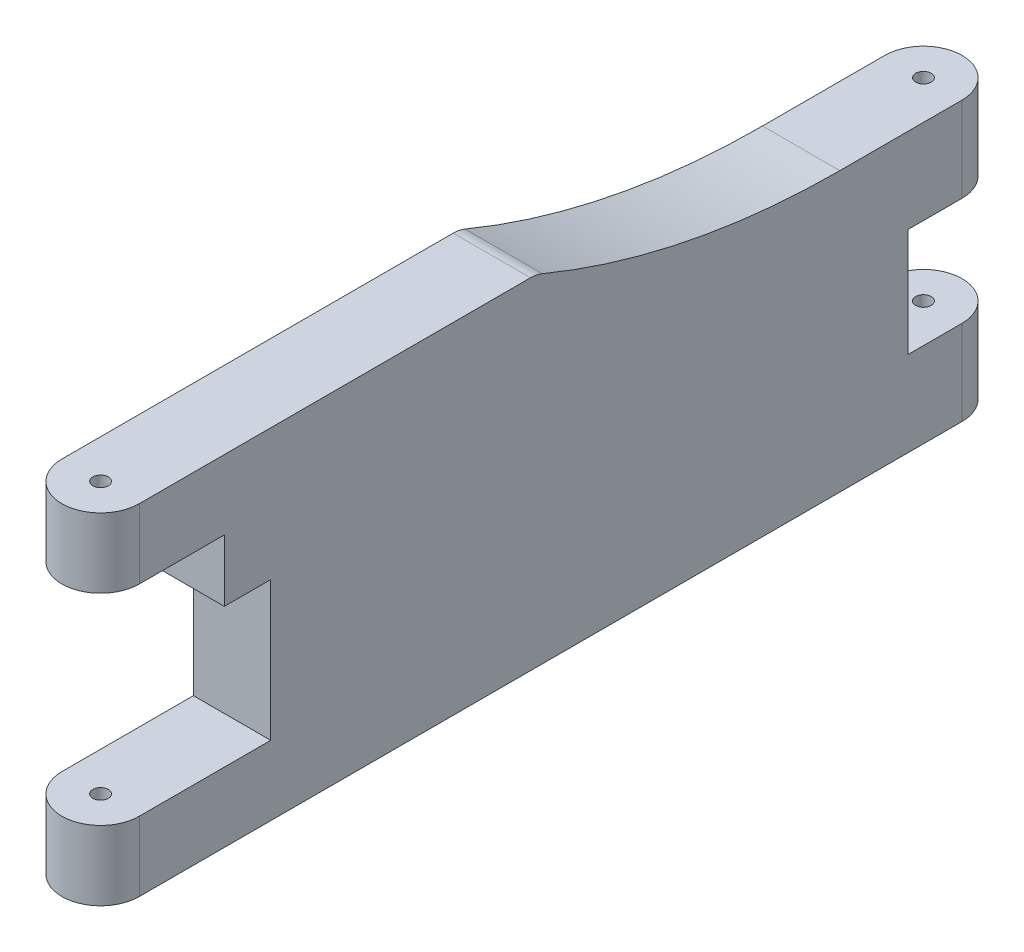
ISO-10303-21;
HEADER;
FILE_DESCRIPTION(('STEP AP214'),'2;1');
FILE_NAME('part.step','',(''),(''),'','','');
FILE_SCHEMA(('AUTOMOTIVE_DESIGN { 1 0 10303 214 1 1 1 1 }'));
ENDSEC;
DATA;
#1=APPLICATION_CONTEXT('core data for automotive mechanical design processes');
#2=APPLICATION_PROTOCOL_DEFINITION('international standard','automotive_design',2000,#1);
#3=PRODUCT_CONTEXT('',#1,'mechanical');
#4=PRODUCT('Part','Part','',(#3));
#5=PRODUCT_RELATED_PRODUCT_CATEGORY('part','',(#4));
#6=PRODUCT_DEFINITION_FORMATION('','',#4);
#7=PRODUCT_DEFINITION_CONTEXT('part definition',#1,'design');
#8=PRODUCT_DEFINITION('design','',#6,#7);
#9=PRODUCT_DEFINITION_SHAPE('','',#8);
#10=(LENGTH_UNIT() NAMED_UNIT(*) SI_UNIT(.MILLI.,.METRE.));
#11=(NAMED_UNIT(*) PLANE_ANGLE_UNIT() SI_UNIT($,.RADIAN.));
#12=(NAMED_UNIT(*) SI_UNIT($,.STERADIAN.) SOLID_ANGLE_UNIT());
#13=UNCERTAINTY_MEASURE_WITH_UNIT(LENGTH_MEASURE(1.E-05),#10,'distance_accuracy_value','');
#14=(GEOMETRIC_REPRESENTATION_CONTEXT(3) GLOBAL_UNCERTAINTY_ASSIGNED_CONTEXT((#13)) GLOBAL_UNIT_ASSIGNED_CONTEXT((#10,
#11,#12)) REPRESENTATION_CONTEXT('',''));
#15=CARTESIAN_POINT('',(0.,0.,0.));
#16=DIRECTION('',(0.,0.,1.));
#17=DIRECTION('',(1.,0.,0.));
#18=AXIS2_PLACEMENT_3D('',#15,#16,#17);
#19=CARTESIAN_POINT('',(0.,22.,0.));
#20=DIRECTION('',(0.,-1.,0.));
#21=DIRECTION('',(0.,0.,-1.));
#22=AXIS2_PLACEMENT_3D('',#19,#20,#21);
#23=CYLINDRICAL_SURFACE('',#22,2.5);
#24=CARTESIAN_POINT('',(0.,5.5,0.));
#25=DIRECTION('',(0.,-1.,0.));
#26=DIRECTION('',(0.,0.,-1.));
#27=AXIS2_PLACEMENT_3D('',#24,#25,#26);
#28=CIRCLE('',#27,2.5);
#29=CARTESIAN_POINT('',(-2.5,5.5,0.));
#30=VERTEX_POINT('',#29);
#31=CARTESIAN_POINT('',(2.5,5.5,0.));
#32=VERTEX_POINT('',#31);
#33=EDGE_CURVE('E212',#30,#32,#28,.T.);
#34=ORIENTED_EDGE('',*,*,#33,.T.);
#35=DIRECTION('',(0.,-1.,0.));
#36=VECTOR('',#35,1.);
#37=CARTESIAN_POINT('',(2.5,22.,0.));
#38=LINE('',#37,#36);
#39=CARTESIAN_POINT('',(2.5,0.,0.));
#40=VERTEX_POINT('',#39);
#41=EDGE_CURVE('E322',#32,#40,#38,.T.);
#42=ORIENTED_EDGE('',*,*,#41,.T.);
#43=CARTESIAN_POINT('',(0.,0.,0.));
#44=DIRECTION('',(0.,1.,0.));
#45=DIRECTION('',(0.,0.,1.));
#46=AXIS2_PLACEMENT_3D('',#43,#44,#45);
#47=CIRCLE('',#46,2.5);
#48=CARTESIAN_POINT('',(-2.5,0.,0.));
#49=VERTEX_POINT('',#48);
#50=EDGE_CURVE('E310',#40,#49,#47,.T.);
#51=ORIENTED_EDGE('',*,*,#50,.T.);
#52=DIRECTION('',(0.,-1.,0.));
#53=VECTOR('',#52,1.);
#54=CARTESIAN_POINT('',(-2.5,22.,0.));
#55=LINE('',#54,#53);
#56=EDGE_CURVE('E318',#30,#49,#55,.T.);
#57=ORIENTED_EDGE('',*,*,#56,.F.);
#58=EDGE_LOOP('',(#34,#42,#51,#57));
#59=FACE_BOUND('',#58,.T.);
#60=ADVANCED_FACE('F35',(#59),#23,.T.);
#61=CARTESIAN_POINT('',(0.,22.,0.));
#62=DIRECTION('',(0.,-1.,0.));
#63=DIRECTION('',(0.,0.,-1.));
#64=AXIS2_PLACEMENT_3D('',#61,#62,#63);
#65=CYLINDRICAL_SURFACE('',#64,0.5);
#66=CARTESIAN_POINT('',(0.,5.5,0.));
#67=DIRECTION('',(0.,-1.,0.));
#68=DIRECTION('',(0.,0.,-1.));
#69=AXIS2_PLACEMENT_3D('',#66,#67,#68);
#70=CIRCLE('',#69,0.5);
#71=CARTESIAN_POINT('',(0.,5.5,-0.5));
#72=VERTEX_POINT('',#71);
#73=EDGE_CURVE('E39',#72,#72,#70,.T.);
#74=ORIENTED_EDGE('',*,*,#73,.F.);
#75=EDGE_LOOP('',(#74));
#76=FACE_BOUND('',#75,.T.);
#77=CARTESIAN_POINT('',(0.,0.,0.));
#78=DIRECTION('',(0.,1.,0.));
#79=DIRECTION('',(0.,0.,1.));
#80=AXIS2_PLACEMENT_3D('',#77,#78,#79);
#81=CIRCLE('',#80,0.5);
#82=CARTESIAN_POINT('',(0.,0.,0.5));
#83=VERTEX_POINT('',#82);
#84=EDGE_CURVE('E290',#83,#83,#81,.T.);
#85=ORIENTED_EDGE('',*,*,#84,.F.);
#86=EDGE_LOOP('',(#85));
#87=FACE_BOUND('',#86,.T.);
#88=ADVANCED_FACE('F370',(#76,#87),#65,.F.);
#89=CARTESIAN_POINT('',(0.,22.,53.2));
#90=DIRECTION('',(0.,-1.,0.));
#91=DIRECTION('',(0.,0.,-1.));
#92=AXIS2_PLACEMENT_3D('',#89,#90,#91);
#93=CYLINDRICAL_SURFACE('',#92,2.5);
#94=CARTESIAN_POINT('',(0.,17.5,53.2));
#95=DIRECTION('',(0.,1.,0.));
#96=DIRECTION('',(0.,0.,1.));
#97=AXIS2_PLACEMENT_3D('',#94,#95,#96);
#98=CIRCLE('',#97,2.5);
#99=CARTESIAN_POINT('',(-2.5,17.5,53.2));
#100=VERTEX_POINT('',#99);
#101=CARTESIAN_POINT('',(2.5,17.5,53.2));
#102=VERTEX_POINT('',#101);
#103=EDGE_CURVE('E284',#100,#102,#98,.T.);
#104=ORIENTED_EDGE('',*,*,#103,.T.);
#105=DIRECTION('',(0.,-1.,0.));
#106=VECTOR('',#105,1.);
#107=CARTESIAN_POINT('',(2.5,22.,53.2));
#108=LINE('',#107,#106);
#109=CARTESIAN_POINT('',(2.5,22.,53.2));
#110=VERTEX_POINT('',#109);
#111=EDGE_CURVE('E326',#110,#102,#108,.T.);
#112=ORIENTED_EDGE('',*,*,#111,.F.);
#113=CARTESIAN_POINT('',(0.,22.,53.2));
#114=DIRECTION('',(0.,1.,0.));
#115=DIRECTION('',(0.,0.,-1.));
#116=AXIS2_PLACEMENT_3D('',#113,#114,#115);
#117=CIRCLE('',#116,2.5);
#118=CARTESIAN_POINT('',(-2.5,22.,53.2));
#119=VERTEX_POINT('',#118);
#120=EDGE_CURVE('E296',#119,#110,#117,.T.);
#121=ORIENTED_EDGE('',*,*,#120,.F.);
#122=DIRECTION('',(0.,-1.,0.));
#123=VECTOR('',#122,1.);
#124=CARTESIAN_POINT('',(-2.5,22.,53.2));
#125=LINE('',#124,#123);
#126=EDGE_CURVE('E315',#119,#100,#125,.T.);
#127=ORIENTED_EDGE('',*,*,#126,.T.);
#128=EDGE_LOOP('',(#104,#112,#121,#127));
#129=FACE_BOUND('',#128,.T.);
#130=ADVANCED_FACE('F428',(#129),#93,.T.);
#131=CARTESIAN_POINT('',(0.,22.,53.2));
#132=DIRECTION('',(0.,-1.,0.));
#133=DIRECTION('',(0.,0.,-1.));
#134=AXIS2_PLACEMENT_3D('',#131,#132,#133);
#135=CYLINDRICAL_SURFACE('',#134,0.500000000000001);
#136=CARTESIAN_POINT('',(0.,17.5,53.2));
#137=DIRECTION('',(0.,1.,0.));
#138=DIRECTION('',(0.,0.,1.));
#139=AXIS2_PLACEMENT_3D('',#136,#137,#138);
#140=CIRCLE('',#139,0.500000000000001);
#141=CARTESIAN_POINT('',(0.,17.5,53.7));
#142=VERTEX_POINT('',#141);
#143=EDGE_CURVE('E283',#142,#142,#140,.T.);
#144=ORIENTED_EDGE('',*,*,#143,.F.);
#145=EDGE_LOOP('',(#144));
#146=FACE_BOUND('',#145,.T.);
#147=CARTESIAN_POINT('',(0.,22.,53.2));
#148=DIRECTION('',(0.,1.,0.));
#149=DIRECTION('',(0.,0.,1.));
#150=AXIS2_PLACEMENT_3D('',#147,#148,#149);
#151=CIRCLE('',#150,0.500000000000001);
#152=CARTESIAN_POINT('',(0.,22.,53.7));
#153=VERTEX_POINT('',#152);
#154=EDGE_CURVE('E287',#153,#153,#151,.T.);
#155=ORIENTED_EDGE('',*,*,#154,.T.);
#156=EDGE_LOOP('',(#155));
#157=FACE_BOUND('',#156,.T.);
#158=ADVANCED_FACE('F465',(#146,#157),#135,.F.);
#159=CARTESIAN_POINT('',(0.,22.,53.2));
#160=DIRECTION('',(0.,-1.,0.));
#161=DIRECTION('',(0.,0.,-1.));
#162=AXIS2_PLACEMENT_3D('',#159,#160,#161);
#163=PLANE('',#162);
#164=DIRECTION('',(0.,0.,-1.));
#165=VECTOR('',#164,1.);
#166=CARTESIAN_POINT('',(2.5,22.,53.2));
#167=LINE('',#166,#165);
#168=CARTESIAN_POINT('',(2.5,22.,27.9040820577346));
#169=VERTEX_POINT('',#168);
#170=EDGE_CURVE('E299',#110,#169,#167,.T.);
#171=ORIENTED_EDGE('',*,*,#170,.T.);
#172=DIRECTION('',(1.,0.,0.));
#173=VECTOR('',#172,1.);
#174=CARTESIAN_POINT('',(0.,22.,27.9040820577346));
#175=LINE('',#174,#173);
#176=CARTESIAN_POINT('',(-2.5,22.,27.9040820577346));
#177=VERTEX_POINT('',#176);
#178=EDGE_CURVE('E44',#169,#177,#175,.F.);
#179=ORIENTED_EDGE('',*,*,#178,.T.);
#180=DIRECTION('',(0.,0.,1.));
#181=VECTOR('',#180,1.);
#182=CARTESIAN_POINT('',(-2.5,22.,24.7780810445954));
#183=LINE('',#182,#181);
#184=EDGE_CURVE('E302',#177,#119,#183,.T.);
#185=ORIENTED_EDGE('',*,*,#184,.T.);
#186=ORIENTED_EDGE('',*,*,#120,.T.);
#187=EDGE_LOOP('',(#171,#179,#185,#186));
#188=FACE_BOUND('',#187,.T.);
#189=ORIENTED_EDGE('',*,*,#154,.F.);
#190=EDGE_LOOP('',(#189));
#191=FACE_BOUND('',#190,.T.);
#192=ADVANCED_FACE('F461',(#188,#191),#163,.F.);
#193=CARTESIAN_POINT('',(0.,0.,53.2));
#194=DIRECTION('',(0.,-1.,0.));
#195=DIRECTION('',(0.,0.,-1.));
#196=AXIS2_PLACEMENT_3D('',#193,#194,#195);
#197=PLANE('',#196);
#198=ORIENTED_EDGE('',*,*,#84,.T.);
#199=EDGE_LOOP('',(#198));
#200=FACE_BOUND('',#199,.T.);
#201=CARTESIAN_POINT('',(0.,0.,53.2));
#202=DIRECTION('',(0.,1.,0.));
#203=DIRECTION('',(0.,0.,-1.));
#204=AXIS2_PLACEMENT_3D('',#201,#202,#203);
#205=CIRCLE('',#204,2.5);
#206=CARTESIAN_POINT('',(-2.5,0.,53.2));
#207=VERTEX_POINT('',#206);
#208=CARTESIAN_POINT('',(2.5,0.,53.2));
#209=VERTEX_POINT('',#208);
#210=EDGE_CURVE('E295',#207,#209,#205,.T.);
#211=ORIENTED_EDGE('',*,*,#210,.F.);
#212=DIRECTION('',(0.,0.,1.));
#213=VECTOR('',#212,1.);
#214=CARTESIAN_POINT('',(-2.5,0.,53.2));
#215=LINE('',#214,#213);
#216=EDGE_CURVE('E300',#49,#207,#215,.T.);
#217=ORIENTED_EDGE('',*,*,#216,.F.);
#218=ORIENTED_EDGE('',*,*,#50,.F.);
#219=DIRECTION('',(0.,0.,-1.));
#220=VECTOR('',#219,1.);
#221=CARTESIAN_POINT('',(2.5,0.,53.2));
#222=LINE('',#221,#220);
#223=EDGE_CURVE('E307',#209,#40,#222,.T.);
#224=ORIENTED_EDGE('',*,*,#223,.F.);
#225=EDGE_LOOP('',(#211,#217,#218,#224));
#226=FACE_BOUND('',#225,.T.);
#227=CARTESIAN_POINT('',(0.,0.,53.2));
#228=DIRECTION('',(0.,1.,0.));
#229=DIRECTION('',(0.,0.,1.));
#230=AXIS2_PLACEMENT_3D('',#227,#228,#229);
#231=CIRCLE('',#230,0.500000000000001);
#232=CARTESIAN_POINT('',(0.,0.,53.7));
#233=VERTEX_POINT('',#232);
#234=EDGE_CURVE('E286',#233,#233,#231,.T.);
#235=ORIENTED_EDGE('',*,*,#234,.T.);
#236=EDGE_LOOP('',(#235));
#237=FACE_BOUND('',#236,.T.);
#238=ADVANCED_FACE('F399',(#200,#226,#237),#197,.T.);
#239=CARTESIAN_POINT('',(2.5,4.5,53.2));
#240=VERTEX_POINT('',#239);
#241=EDGE_CURVE('E325',#240,#209,#108,.T.);
#242=ORIENTED_EDGE('',*,*,#241,.F.);
#243=CARTESIAN_POINT('',(0.,4.5,53.2));
#244=DIRECTION('',(0.,-1.,0.));
#245=DIRECTION('',(0.,0.,-1.));
#246=AXIS2_PLACEMENT_3D('',#243,#244,#245);
#247=CIRCLE('',#246,2.5);
#248=CARTESIAN_POINT('',(-2.5,4.5,53.2));
#249=VERTEX_POINT('',#248);
#250=EDGE_CURVE('E281',#240,#249,#247,.T.);
#251=ORIENTED_EDGE('',*,*,#250,.T.);
#252=EDGE_CURVE('E304',#249,#207,#125,.T.);
#253=ORIENTED_EDGE('',*,*,#252,.T.);
#254=ORIENTED_EDGE('',*,*,#210,.T.);
#255=EDGE_LOOP('',(#242,#251,#253,#254));
#256=FACE_BOUND('',#255,.T.);
#257=ADVANCED_FACE('F405',(#256),#93,.T.);
#258=CARTESIAN_POINT('',(2.5,22.,53.2));
#259=DIRECTION('',(-1.,0.,0.));
#260=DIRECTION('',(0.,0.,1.));
#261=AXIS2_PLACEMENT_3D('',#258,#259,#260);
#262=PLANE('',#261);
#263=ORIENTED_EDGE('',*,*,#41,.F.);
#264=DIRECTION('',(0.,0.,-1.));
#265=VECTOR('',#264,1.);
#266=CARTESIAN_POINT('',(2.5,5.5,-2.5));
#267=LINE('',#266,#265);
#268=CARTESIAN_POINT('',(2.5,5.5,3.5));
#269=VERTEX_POINT('',#268);
#270=EDGE_CURVE('E200',#269,#32,#267,.T.);
#271=ORIENTED_EDGE('',*,*,#270,.F.);
#272=DIRECTION('',(0.,-1.,0.));
#273=VECTOR('',#272,1.);
#274=CARTESIAN_POINT('',(2.5,5.5,3.5));
#275=LINE('',#274,#273);
#276=CARTESIAN_POINT('',(2.5,12.5,3.5));
#277=VERTEX_POINT('',#276);
#278=EDGE_CURVE('E189',#277,#269,#275,.T.);
#279=ORIENTED_EDGE('',*,*,#278,.F.);
#280=DIRECTION('',(0.,0.,1.));
#281=VECTOR('',#280,1.);
#282=CARTESIAN_POINT('',(2.5,12.5,3.5));
#283=LINE('',#282,#281);
#284=CARTESIAN_POINT('',(2.5,12.5,0.));
#285=VERTEX_POINT('',#284);
#286=EDGE_CURVE('E179',#285,#277,#283,.T.);
#287=ORIENTED_EDGE('',*,*,#286,.F.);
#288=CARTESIAN_POINT('',(2.5,18.,0.));
#289=VERTEX_POINT('',#288);
#290=EDGE_CURVE('E323',#289,#285,#38,.T.);
#291=ORIENTED_EDGE('',*,*,#290,.F.);
#292=DIRECTION('',(0.,0.,-1.));
#293=VECTOR('',#292,1.);
#294=CARTESIAN_POINT('',(2.5,18.,-2.5));
#295=LINE('',#294,#293);
#296=CARTESIAN_POINT('',(2.5,18.,7.90408205773456));
#297=VERTEX_POINT('',#296);
#298=EDGE_CURVE('E214',#297,#289,#295,.T.);
#299=ORIENTED_EDGE('',*,*,#298,.F.);
#300=CARTESIAN_POINT('',(2.5,68.,7.90408205773457));
#301=DIRECTION('',(-1.,0.,0.));
#302=DIRECTION('',(0.,0.,1.));
#303=AXIS2_PLACEMENT_3D('',#300,#301,#302);
#304=CIRCLE('',#303,50.);
#305=CARTESIAN_POINT('',(2.5,21.8461538461538,27.1348512885038));
#306=VERTEX_POINT('',#305);
#307=EDGE_CURVE('E350',#297,#306,#304,.T.);
#308=ORIENTED_EDGE('',*,*,#307,.T.);
#309=CARTESIAN_POINT('',(2.5,20.,27.9040820577346));
#310=DIRECTION('',(-1.,0.,0.));
#311=DIRECTION('',(0.,0.,1.));
#312=AXIS2_PLACEMENT_3D('',#309,#310,#311);
#313=CIRCLE('',#312,2.);
#314=EDGE_CURVE('E358',#306,#169,#313,.F.);
#315=ORIENTED_EDGE('',*,*,#314,.T.);
#316=ORIENTED_EDGE('',*,*,#170,.F.);
#317=ORIENTED_EDGE('',*,*,#111,.T.);
#318=DIRECTION('',(0.,0.,1.));
#319=VECTOR('',#318,1.);
#320=CARTESIAN_POINT('',(2.5,17.5,55.7));
#321=LINE('',#320,#319);
#322=CARTESIAN_POINT('',(2.5,17.5,47.7));
#323=VERTEX_POINT('',#322);
#324=EDGE_CURVE('E253',#323,#102,#321,.T.);
#325=ORIENTED_EDGE('',*,*,#324,.F.);
#326=DIRECTION('',(0.,1.,0.));
#327=VECTOR('',#326,1.);
#328=CARTESIAN_POINT('',(2.5,13.5,47.7));
#329=LINE('',#328,#327);
#330=CARTESIAN_POINT('',(2.5,13.5,47.7));
#331=VERTEX_POINT('',#330);
#332=EDGE_CURVE('E250',#331,#323,#329,.T.);
#333=ORIENTED_EDGE('',*,*,#332,.F.);
#334=DIRECTION('',(0.,0.,1.));
#335=VECTOR('',#334,1.);
#336=CARTESIAN_POINT('',(2.5,13.5,44.7));
#337=LINE('',#336,#335);
#338=CARTESIAN_POINT('',(2.5,13.5,44.7));
#339=VERTEX_POINT('',#338);
#340=EDGE_CURVE('E247',#339,#331,#337,.T.);
#341=ORIENTED_EDGE('',*,*,#340,.F.);
#342=DIRECTION('',(0.,1.,0.));
#343=VECTOR('',#342,1.);
#344=CARTESIAN_POINT('',(2.5,13.5,44.7));
#345=LINE('',#344,#343);
#346=CARTESIAN_POINT('',(2.5,4.5,44.7));
#347=VERTEX_POINT('',#346);
#348=EDGE_CURVE('E244',#347,#339,#345,.T.);
#349=ORIENTED_EDGE('',*,*,#348,.F.);
#350=DIRECTION('',(0.,0.,-1.));
#351=VECTOR('',#350,1.);
#352=CARTESIAN_POINT('',(2.5,4.5,44.7));
#353=LINE('',#352,#351);
#354=EDGE_CURVE('E237',#240,#347,#353,.T.);
#355=ORIENTED_EDGE('',*,*,#354,.F.);
#356=ORIENTED_EDGE('',*,*,#241,.T.);
#357=ORIENTED_EDGE('',*,*,#223,.T.);
#358=EDGE_LOOP('',(#263,#271,#279,#287,#291,#299,#308,#315,#316,#317,#325,#333,#341,#349,#355,
#356,#357));
#359=FACE_BOUND('',#358,.T.);
#360=ADVANCED_FACE('F198',(#359),#262,.F.);
#361=ORIENTED_EDGE('',*,*,#290,.T.);
#362=CARTESIAN_POINT('',(0.,12.5,0.));
#363=DIRECTION('',(0.,1.,0.));
#364=DIRECTION('',(0.,0.,1.));
#365=AXIS2_PLACEMENT_3D('',#362,#363,#364);
#366=CIRCLE('',#365,2.5);
#367=CARTESIAN_POINT('',(-2.5,12.5,0.));
#368=VERTEX_POINT('',#367);
#369=EDGE_CURVE('E184',#285,#368,#366,.T.);
#370=ORIENTED_EDGE('',*,*,#369,.T.);
#371=CARTESIAN_POINT('',(-2.5,18.,0.));
#372=VERTEX_POINT('',#371);
#373=EDGE_CURVE('E319',#372,#368,#55,.T.);
#374=ORIENTED_EDGE('',*,*,#373,.F.);
#375=CARTESIAN_POINT('',(0.,18.,0.));
#376=DIRECTION('',(0.,-1.,0.));
#377=DIRECTION('',(0.,0.,-1.));
#378=AXIS2_PLACEMENT_3D('',#375,#376,#377);
#379=CIRCLE('',#378,2.5);
#380=EDGE_CURVE('E219',#372,#289,#379,.T.);
#381=ORIENTED_EDGE('',*,*,#380,.T.);
#382=EDGE_LOOP('',(#361,#370,#374,#381));
#383=FACE_BOUND('',#382,.T.);
#384=ADVANCED_FACE('F389',(#383),#23,.T.);
#385=CARTESIAN_POINT('',(-2.5,22.,53.2));
#386=DIRECTION('',(1.,0.,0.));
#387=DIRECTION('',(0.,0.,-1.));
#388=AXIS2_PLACEMENT_3D('',#385,#386,#387);
#389=PLANE('',#388);
#390=DIRECTION('',(0.,1.,0.));
#391=VECTOR('',#390,1.);
#392=CARTESIAN_POINT('',(-2.5,22.,31.7));
#393=LINE('',#392,#391);
#394=CARTESIAN_POINT('',(-2.5,4.,31.7));
#395=VERTEX_POINT('',#394);
#396=CARTESIAN_POINT('',(-2.5,14.,31.7));
#397=VERTEX_POINT('',#396);
#398=EDGE_CURVE('E339',#395,#397,#393,.T.);
#399=ORIENTED_EDGE('',*,*,#398,.T.);
#400=DIRECTION('',(0.,0.,1.));
#401=VECTOR('',#400,1.);
#402=CARTESIAN_POINT('',(-2.5,14.,53.2));
#403=LINE('',#402,#401);
#404=CARTESIAN_POINT('',(-2.5,14.,36.7));
#405=VERTEX_POINT('',#404);
#406=EDGE_CURVE('E342',#397,#405,#403,.T.);
#407=ORIENTED_EDGE('',*,*,#406,.T.);
#408=DIRECTION('',(0.,-1.,0.));
#409=VECTOR('',#408,1.);
#410=CARTESIAN_POINT('',(-2.5,22.,36.7));
#411=LINE('',#410,#409);
#412=CARTESIAN_POINT('',(-2.5,4.,36.7));
#413=VERTEX_POINT('',#412);
#414=EDGE_CURVE('E329',#405,#413,#411,.T.);
#415=ORIENTED_EDGE('',*,*,#414,.T.);
#416=DIRECTION('',(0.,0.,-1.));
#417=VECTOR('',#416,1.);
#418=CARTESIAN_POINT('',(-2.5,4.,53.2));
#419=LINE('',#418,#417);
#420=EDGE_CURVE('E336',#413,#395,#419,.T.);
#421=ORIENTED_EDGE('',*,*,#420,.T.);
#422=EDGE_LOOP('',(#399,#407,#415,#421));
#423=FACE_BOUND('',#422,.T.);
#424=DIRECTION('',(0.,-1.,0.));
#425=VECTOR('',#424,1.);
#426=CARTESIAN_POINT('',(-2.5,5.5,3.5));
#427=LINE('',#426,#425);
#428=CARTESIAN_POINT('',(-2.5,12.5,3.5));
#429=VERTEX_POINT('',#428);
#430=CARTESIAN_POINT('',(-2.5,5.5,3.5));
#431=VERTEX_POINT('',#430);
#432=EDGE_CURVE('E52',#429,#431,#427,.T.);
#433=ORIENTED_EDGE('',*,*,#432,.T.);
#434=DIRECTION('',(0.,0.,-1.));
#435=VECTOR('',#434,1.);
#436=CARTESIAN_POINT('',(-2.5,5.5,-2.5));
#437=LINE('',#436,#435);
#438=EDGE_CURVE('E195',#431,#30,#437,.T.);
#439=ORIENTED_EDGE('',*,*,#438,.T.);
#440=ORIENTED_EDGE('',*,*,#56,.T.);
#441=ORIENTED_EDGE('',*,*,#216,.T.);
#442=ORIENTED_EDGE('',*,*,#252,.F.);
#443=DIRECTION('',(0.,0.,-1.));
#444=VECTOR('',#443,1.);
#445=CARTESIAN_POINT('',(-2.5,4.5,44.7));
#446=LINE('',#445,#444);
#447=CARTESIAN_POINT('',(-2.5,4.5,44.7));
#448=VERTEX_POINT('',#447);
#449=EDGE_CURVE('E256',#249,#448,#446,.T.);
#450=ORIENTED_EDGE('',*,*,#449,.T.);
#451=DIRECTION('',(0.,1.,0.));
#452=VECTOR('',#451,1.);
#453=CARTESIAN_POINT('',(-2.5,13.5,44.7));
#454=LINE('',#453,#452);
#455=CARTESIAN_POINT('',(-2.5,13.5,44.7));
#456=VERTEX_POINT('',#455);
#457=EDGE_CURVE('E259',#448,#456,#454,.T.);
#458=ORIENTED_EDGE('',*,*,#457,.T.);
#459=DIRECTION('',(0.,0.,1.));
#460=VECTOR('',#459,1.);
#461=CARTESIAN_POINT('',(-2.5,13.5,44.7));
#462=LINE('',#461,#460);
#463=CARTESIAN_POINT('',(-2.5,13.5,47.7));
#464=VERTEX_POINT('',#463);
#465=EDGE_CURVE('E262',#456,#464,#462,.T.);
#466=ORIENTED_EDGE('',*,*,#465,.T.);
#467=DIRECTION('',(0.,1.,0.));
#468=VECTOR('',#467,1.);
#469=CARTESIAN_POINT('',(-2.5,13.5,47.7));
#470=LINE('',#469,#468);
#471=CARTESIAN_POINT('',(-2.5,17.5,47.7));
#472=VERTEX_POINT('',#471);
#473=EDGE_CURVE('E265',#464,#472,#470,.T.);
#474=ORIENTED_EDGE('',*,*,#473,.T.);
#475=DIRECTION('',(0.,0.,1.));
#476=VECTOR('',#475,1.);
#477=CARTESIAN_POINT('',(-2.5,17.5,55.7));
#478=LINE('',#477,#476);
#479=EDGE_CURVE('E268',#472,#100,#478,.T.);
#480=ORIENTED_EDGE('',*,*,#479,.T.);
#481=ORIENTED_EDGE('',*,*,#126,.F.);
#482=ORIENTED_EDGE('',*,*,#184,.F.);
#483=CARTESIAN_POINT('',(-2.5,20.,27.9040820577346));
#484=DIRECTION('',(1.,0.,0.));
#485=DIRECTION('',(0.,0.,-1.));
#486=AXIS2_PLACEMENT_3D('',#483,#484,#485);
#487=CIRCLE('',#486,2.);
#488=CARTESIAN_POINT('',(-2.5,21.8461538461538,27.1348512885038));
#489=VERTEX_POINT('',#488);
#490=EDGE_CURVE('E11',#177,#489,#487,.F.);
#491=ORIENTED_EDGE('',*,*,#490,.T.);
#492=CARTESIAN_POINT('',(-2.5,68.,7.90408205773457));
#493=DIRECTION('',(1.,0.,0.));
#494=DIRECTION('',(0.,0.,-1.));
#495=AXIS2_PLACEMENT_3D('',#492,#493,#494);
#496=CIRCLE('',#495,50.);
#497=CARTESIAN_POINT('',(-2.5,18.,7.90408205773456));
#498=VERTEX_POINT('',#497);
#499=EDGE_CURVE('E353',#489,#498,#496,.T.);
#500=ORIENTED_EDGE('',*,*,#499,.T.);
#501=DIRECTION('',(0.,0.,-1.));
#502=VECTOR('',#501,1.);
#503=CARTESIAN_POINT('',(-2.5,18.,-2.5));
#504=LINE('',#503,#502);
#505=EDGE_CURVE('E216',#498,#372,#504,.T.);
#506=ORIENTED_EDGE('',*,*,#505,.T.);
#507=ORIENTED_EDGE('',*,*,#373,.T.);
#508=DIRECTION('',(0.,0.,1.));
#509=VECTOR('',#508,1.);
#510=CARTESIAN_POINT('',(-2.5,12.5,3.5));
#511=LINE('',#510,#509);
#512=EDGE_CURVE('E202',#368,#429,#511,.T.);
#513=ORIENTED_EDGE('',*,*,#512,.T.);
#514=EDGE_LOOP('',(#433,#439,#440,#441,#442,#450,#458,#466,#474,#480,#481,#482,#491,#500,#506,
#507,#513));
#515=FACE_BOUND('',#514,.T.);
#516=ADVANCED_FACE('F368',(#423,#515),#389,.F.);
#517=CARTESIAN_POINT('',(0.,12.5,0.));
#518=DIRECTION('',(0.,1.,0.));
#519=DIRECTION('',(0.,0.,1.));
#520=AXIS2_PLACEMENT_3D('',#517,#518,#519);
#521=CIRCLE('',#520,0.5);
#522=CARTESIAN_POINT('',(0.,12.5,0.5));
#523=VERTEX_POINT('',#522);
#524=EDGE_CURVE('E209',#523,#523,#521,.T.);
#525=ORIENTED_EDGE('',*,*,#524,.F.);
#526=EDGE_LOOP('',(#525));
#527=FACE_BOUND('',#526,.T.);
#528=CARTESIAN_POINT('',(0.,18.,0.));
#529=DIRECTION('',(0.,-1.,0.));
#530=DIRECTION('',(0.,0.,-1.));
#531=AXIS2_PLACEMENT_3D('',#528,#529,#530);
#532=CIRCLE('',#531,0.5);
#533=CARTESIAN_POINT('',(0.,18.,-0.5));
#534=VERTEX_POINT('',#533);
#535=EDGE_CURVE('E218',#534,#534,#532,.T.);
#536=ORIENTED_EDGE('',*,*,#535,.F.);
#537=EDGE_LOOP('',(#536));
#538=FACE_BOUND('',#537,.T.);
#539=ADVANCED_FACE('F364',(#527,#538),#65,.F.);
#540=CARTESIAN_POINT('',(0.,4.5,53.2));
#541=DIRECTION('',(0.,-1.,0.));
#542=DIRECTION('',(0.,0.,-1.));
#543=AXIS2_PLACEMENT_3D('',#540,#541,#542);
#544=CIRCLE('',#543,0.500000000000001);
#545=CARTESIAN_POINT('',(0.,4.5,52.7));
#546=VERTEX_POINT('',#545);
#547=EDGE_CURVE('E274',#546,#546,#544,.T.);
#548=ORIENTED_EDGE('',*,*,#547,.F.);
#549=EDGE_LOOP('',(#548));
#550=FACE_BOUND('',#549,.T.);
#551=ORIENTED_EDGE('',*,*,#234,.F.);
#552=EDGE_LOOP('',(#551));
#553=FACE_BOUND('',#552,.T.);
#554=ADVANCED_FACE('F367',(#550,#553),#135,.F.);
#555=CARTESIAN_POINT('',(-2.5,17.5,55.7));
#556=DIRECTION('',(0.,1.,0.));
#557=DIRECTION('',(0.,0.,1.));
#558=AXIS2_PLACEMENT_3D('',#555,#556,#557);
#559=PLANE('',#558);
#560=ORIENTED_EDGE('',*,*,#143,.T.);
#561=EDGE_LOOP('',(#560));
#562=FACE_BOUND('',#561,.T.);
#563=ORIENTED_EDGE('',*,*,#103,.F.);
#564=ORIENTED_EDGE('',*,*,#479,.F.);
#565=DIRECTION('',(1.,0.,0.));
#566=VECTOR('',#565,1.);
#567=CARTESIAN_POINT('',(-2.5,17.5,47.7));
#568=LINE('',#567,#566);
#569=EDGE_CURVE('E272',#472,#323,#568,.T.);
#570=ORIENTED_EDGE('',*,*,#569,.T.);
#571=ORIENTED_EDGE('',*,*,#324,.T.);
#572=EDGE_LOOP('',(#563,#564,#570,#571));
#573=FACE_BOUND('',#572,.T.);
#574=ADVANCED_FACE('F425',(#562,#573),#559,.F.);
#575=CARTESIAN_POINT('',(-2.5,4.5,44.7));
#576=DIRECTION('',(0.,-1.,0.));
#577=DIRECTION('',(0.,0.,-1.));
#578=AXIS2_PLACEMENT_3D('',#575,#576,#577);
#579=PLANE('',#578);
#580=ORIENTED_EDGE('',*,*,#547,.T.);
#581=EDGE_LOOP('',(#580));
#582=FACE_BOUND('',#581,.T.);
#583=ORIENTED_EDGE('',*,*,#354,.T.);
#584=DIRECTION('',(1.,0.,0.));
#585=VECTOR('',#584,1.);
#586=CARTESIAN_POINT('',(-2.5,4.5,44.7));
#587=LINE('',#586,#585);
#588=EDGE_CURVE('E271',#448,#347,#587,.T.);
#589=ORIENTED_EDGE('',*,*,#588,.F.);
#590=ORIENTED_EDGE('',*,*,#449,.F.);
#591=ORIENTED_EDGE('',*,*,#250,.F.);
#592=EDGE_LOOP('',(#583,#589,#590,#591));
#593=FACE_BOUND('',#592,.T.);
#594=ADVANCED_FACE('F409',(#582,#593),#579,.F.);
#595=CARTESIAN_POINT('',(-2.5,13.5,47.7));
#596=DIRECTION('',(0.,0.,-1.));
#597=DIRECTION('',(-1.,0.,0.));
#598=AXIS2_PLACEMENT_3D('',#595,#596,#597);
#599=PLANE('',#598);
#600=ORIENTED_EDGE('',*,*,#569,.F.);
#601=ORIENTED_EDGE('',*,*,#473,.F.);
#602=DIRECTION('',(1.,0.,0.));
#603=VECTOR('',#602,1.);
#604=CARTESIAN_POINT('',(-2.5,13.5,47.7));
#605=LINE('',#604,#603);
#606=EDGE_CURVE('E275',#464,#331,#605,.T.);
#607=ORIENTED_EDGE('',*,*,#606,.T.);
#608=ORIENTED_EDGE('',*,*,#332,.T.);
#609=EDGE_LOOP('',(#600,#601,#607,#608));
#610=FACE_BOUND('',#609,.T.);
#611=ADVANCED_FACE('F423',(#610),#599,.F.);
#612=CARTESIAN_POINT('',(-2.5,13.5,44.7));
#613=DIRECTION('',(0.,1.,0.));
#614=DIRECTION('',(0.,0.,1.));
#615=AXIS2_PLACEMENT_3D('',#612,#613,#614);
#616=PLANE('',#615);
#617=ORIENTED_EDGE('',*,*,#606,.F.);
#618=ORIENTED_EDGE('',*,*,#465,.F.);
#619=DIRECTION('',(1.,0.,0.));
#620=VECTOR('',#619,1.);
#621=CARTESIAN_POINT('',(-2.5,13.5,44.7));
#622=LINE('',#621,#620);
#623=EDGE_CURVE('E277',#456,#339,#622,.T.);
#624=ORIENTED_EDGE('',*,*,#623,.T.);
#625=ORIENTED_EDGE('',*,*,#340,.T.);
#626=EDGE_LOOP('',(#617,#618,#624,#625));
#627=FACE_BOUND('',#626,.T.);
#628=ADVANCED_FACE('F417',(#627),#616,.F.);
#629=CARTESIAN_POINT('',(-2.5,13.5,44.7));
#630=DIRECTION('',(0.,0.,-1.));
#631=DIRECTION('',(-1.,0.,0.));
#632=AXIS2_PLACEMENT_3D('',#629,#630,#631);
#633=PLANE('',#632);
#634=ORIENTED_EDGE('',*,*,#623,.F.);
#635=ORIENTED_EDGE('',*,*,#457,.F.);
#636=ORIENTED_EDGE('',*,*,#588,.T.);
#637=ORIENTED_EDGE('',*,*,#348,.T.);
#638=EDGE_LOOP('',(#634,#635,#636,#637));
#639=FACE_BOUND('',#638,.T.);
#640=ADVANCED_FACE('F412',(#639),#633,.F.);
#641=CARTESIAN_POINT('',(-10.,14.,31.7));
#642=DIRECTION('',(0.,1.,0.));
#643=DIRECTION('',(0.,0.,1.));
#644=AXIS2_PLACEMENT_3D('',#641,#642,#643);
#645=PLANE('',#644);
#646=DIRECTION('',(1.,0.,0.));
#647=VECTOR('',#646,1.);
#648=CARTESIAN_POINT('',(-10.,14.,31.7));
#649=LINE('',#648,#647);
#650=CARTESIAN_POINT('',(0.,14.,31.7));
#651=VERTEX_POINT('',#650);
#652=EDGE_CURVE('E235',#397,#651,#649,.T.);
#653=ORIENTED_EDGE('',*,*,#652,.T.);
#654=DIRECTION('',(0.,0.,1.));
#655=VECTOR('',#654,1.);
#656=CARTESIAN_POINT('',(0.,14.,31.7));
#657=LINE('',#656,#655);
#658=CARTESIAN_POINT('',(0.,14.,36.7));
#659=VERTEX_POINT('',#658);
#660=EDGE_CURVE('E222',#651,#659,#657,.T.);
#661=ORIENTED_EDGE('',*,*,#660,.T.);
#662=DIRECTION('',(1.,0.,0.));
#663=VECTOR('',#662,1.);
#664=CARTESIAN_POINT('',(-10.,14.,36.7));
#665=LINE('',#664,#663);
#666=EDGE_CURVE('E234',#405,#659,#665,.T.);
#667=ORIENTED_EDGE('',*,*,#666,.F.);
#668=ORIENTED_EDGE('',*,*,#406,.F.);
#669=EDGE_LOOP('',(#653,#661,#667,#668));
#670=FACE_BOUND('',#669,.T.);
#671=ADVANCED_FACE('F497',(#670),#645,.F.);
#672=CARTESIAN_POINT('',(-10.,4.,31.7));
#673=DIRECTION('',(0.,0.,-1.));
#674=DIRECTION('',(-1.,0.,0.));
#675=AXIS2_PLACEMENT_3D('',#672,#673,#674);
#676=PLANE('',#675);
#677=DIRECTION('',(1.,0.,0.));
#678=VECTOR('',#677,1.);
#679=CARTESIAN_POINT('',(-10.,4.,31.7));
#680=LINE('',#679,#678);
#681=CARTESIAN_POINT('',(0.,4.,31.7));
#682=VERTEX_POINT('',#681);
#683=EDGE_CURVE('E238',#395,#682,#680,.T.);
#684=ORIENTED_EDGE('',*,*,#683,.T.);
#685=DIRECTION('',(0.,1.,0.));
#686=VECTOR('',#685,1.);
#687=CARTESIAN_POINT('',(0.,4.,31.7));
#688=LINE('',#687,#686);
#689=EDGE_CURVE('E231',#682,#651,#688,.T.);
#690=ORIENTED_EDGE('',*,*,#689,.T.);
#691=ORIENTED_EDGE('',*,*,#652,.F.);
#692=ORIENTED_EDGE('',*,*,#398,.F.);
#693=EDGE_LOOP('',(#684,#690,#691,#692));
#694=FACE_BOUND('',#693,.T.);
#695=ADVANCED_FACE('F502',(#694),#676,.F.);
#696=CARTESIAN_POINT('',(-10.,4.,36.7));
#697=DIRECTION('',(0.,-1.,0.));
#698=DIRECTION('',(0.,0.,-1.));
#699=AXIS2_PLACEMENT_3D('',#696,#697,#698);
#700=PLANE('',#699);
#701=DIRECTION('',(1.,0.,0.));
#702=VECTOR('',#701,1.);
#703=CARTESIAN_POINT('',(-10.,4.,36.7));
#704=LINE('',#703,#702);
#705=CARTESIAN_POINT('',(0.,4.,36.7));
#706=VERTEX_POINT('',#705);
#707=EDGE_CURVE('E240',#413,#706,#704,.T.);
#708=ORIENTED_EDGE('',*,*,#707,.T.);
#709=DIRECTION('',(0.,0.,-1.));
#710=VECTOR('',#709,1.);
#711=CARTESIAN_POINT('',(0.,4.,36.7));
#712=LINE('',#711,#710);
#713=EDGE_CURVE('E228',#706,#682,#712,.T.);
#714=ORIENTED_EDGE('',*,*,#713,.T.);
#715=ORIENTED_EDGE('',*,*,#683,.F.);
#716=ORIENTED_EDGE('',*,*,#420,.F.);
#717=EDGE_LOOP('',(#708,#714,#715,#716));
#718=FACE_BOUND('',#717,.T.);
#719=ADVANCED_FACE('F507',(#718),#700,.F.);
#720=CARTESIAN_POINT('',(-10.,14.,36.7));
#721=DIRECTION('',(0.,0.,1.));
#722=DIRECTION('',(1.,0.,0.));
#723=AXIS2_PLACEMENT_3D('',#720,#721,#722);
#724=PLANE('',#723);
#725=ORIENTED_EDGE('',*,*,#666,.T.);
#726=DIRECTION('',(0.,-1.,0.));
#727=VECTOR('',#726,1.);
#728=CARTESIAN_POINT('',(0.,14.,36.7));
#729=LINE('',#728,#727);
#730=EDGE_CURVE('E225',#659,#706,#729,.T.);
#731=ORIENTED_EDGE('',*,*,#730,.T.);
#732=ORIENTED_EDGE('',*,*,#707,.F.);
#733=ORIENTED_EDGE('',*,*,#414,.F.);
#734=EDGE_LOOP('',(#725,#731,#732,#733));
#735=FACE_BOUND('',#734,.T.);
#736=ADVANCED_FACE('F504',(#735),#724,.F.);
#737=CARTESIAN_POINT('',(0.,0.,0.));
#738=DIRECTION('',(1.,0.,0.));
#739=DIRECTION('',(0.,0.,-1.));
#740=AXIS2_PLACEMENT_3D('',#737,#738,#739);
#741=PLANE('',#740);
#742=ORIENTED_EDGE('',*,*,#660,.F.);
#743=ORIENTED_EDGE('',*,*,#689,.F.);
#744=ORIENTED_EDGE('',*,*,#713,.F.);
#745=ORIENTED_EDGE('',*,*,#730,.F.);
#746=EDGE_LOOP('',(#742,#743,#744,#745));
#747=FACE_BOUND('',#746,.T.);
#748=ADVANCED_FACE('F377',(#747),#741,.F.);
#749=CARTESIAN_POINT('',(-2.5,18.,-2.5));
#750=DIRECTION('',(0.,-1.,0.));
#751=DIRECTION('',(0.,0.,-1.));
#752=AXIS2_PLACEMENT_3D('',#749,#750,#751);
#753=PLANE('',#752);
#754=ORIENTED_EDGE('',*,*,#535,.T.);
#755=EDGE_LOOP('',(#754));
#756=FACE_BOUND('',#755,.T.);
#757=ORIENTED_EDGE('',*,*,#505,.F.);
#758=DIRECTION('',(1.,0.,0.));
#759=VECTOR('',#758,1.);
#760=CARTESIAN_POINT('',(-2.5,18.,7.90408205773456));
#761=LINE('',#760,#759);
#762=EDGE_CURVE('E345',#498,#297,#761,.T.);
#763=ORIENTED_EDGE('',*,*,#762,.T.);
#764=ORIENTED_EDGE('',*,*,#298,.T.);
#765=ORIENTED_EDGE('',*,*,#380,.F.);
#766=EDGE_LOOP('',(#757,#763,#764,#765));
#767=FACE_BOUND('',#766,.T.);
#768=ADVANCED_FACE('F373',(#756,#767),#753,.F.);
#769=CARTESIAN_POINT('',(-2.5,68.,7.90408205773457));
#770=DIRECTION('',(1.,0.,0.));
#771=DIRECTION('',(0.,0.,-1.));
#772=AXIS2_PLACEMENT_3D('',#769,#770,#771);
#773=CYLINDRICAL_SURFACE('',#772,50.);
#774=ORIENTED_EDGE('',*,*,#499,.F.);
#775=DIRECTION('',(1.,0.,0.));
#776=VECTOR('',#775,1.);
#777=CARTESIAN_POINT('',(-2.5,21.8461538461538,27.1348512885038));
#778=LINE('',#777,#776);
#779=EDGE_CURVE('E355',#489,#306,#778,.T.);
#780=ORIENTED_EDGE('',*,*,#779,.T.);
#781=ORIENTED_EDGE('',*,*,#307,.F.);
#782=ORIENTED_EDGE('',*,*,#762,.F.);
#783=EDGE_LOOP('',(#774,#780,#781,#782));
#784=FACE_BOUND('',#783,.T.);
#785=ADVANCED_FACE('F376',(#784),#773,.F.);
#786=CARTESIAN_POINT('',(-2.5,20.,27.9040820577346));
#787=DIRECTION('',(1.,0.,0.));
#788=DIRECTION('',(0.,0.,-1.));
#789=AXIS2_PLACEMENT_3D('',#786,#787,#788);
#790=CYLINDRICAL_SURFACE('',#789,2.);
#791=ORIENTED_EDGE('',*,*,#490,.F.);
#792=ORIENTED_EDGE('',*,*,#178,.F.);
#793=ORIENTED_EDGE('',*,*,#314,.F.);
#794=ORIENTED_EDGE('',*,*,#779,.F.);
#795=EDGE_LOOP('',(#791,#792,#793,#794));
#796=FACE_BOUND('',#795,.T.);
#797=ADVANCED_FACE('F37',(#796),#790,.T.);
#798=CARTESIAN_POINT('',(-2.5,5.5,-2.5));
#799=DIRECTION('',(0.,-1.,0.));
#800=DIRECTION('',(0.,0.,-1.));
#801=AXIS2_PLACEMENT_3D('',#798,#799,#800);
#802=PLANE('',#801);
#803=ORIENTED_EDGE('',*,*,#73,.T.);
#804=EDGE_LOOP('',(#803));
#805=FACE_BOUND('',#804,.T.);
#806=ORIENTED_EDGE('',*,*,#33,.F.);
#807=ORIENTED_EDGE('',*,*,#438,.F.);
#808=DIRECTION('',(1.,0.,0.));
#809=VECTOR('',#808,1.);
#810=CARTESIAN_POINT('',(-2.5,5.5,3.5));
#811=LINE('',#810,#809);
#812=EDGE_CURVE('E194',#431,#269,#811,.T.);
#813=ORIENTED_EDGE('',*,*,#812,.T.);
#814=ORIENTED_EDGE('',*,*,#270,.T.);
#815=EDGE_LOOP('',(#806,#807,#813,#814));
#816=FACE_BOUND('',#815,.T.);
#817=ADVANCED_FACE('F433',(#805,#816),#802,.F.);
#818=CARTESIAN_POINT('',(-2.5,12.5,3.5));
#819=DIRECTION('',(0.,1.,0.));
#820=DIRECTION('',(0.,0.,1.));
#821=AXIS2_PLACEMENT_3D('',#818,#819,#820);
#822=PLANE('',#821);
#823=ORIENTED_EDGE('',*,*,#524,.T.);
#824=EDGE_LOOP('',(#823));
#825=FACE_BOUND('',#824,.T.);
#826=ORIENTED_EDGE('',*,*,#286,.T.);
#827=DIRECTION('',(1.,0.,0.));
#828=VECTOR('',#827,1.);
#829=CARTESIAN_POINT('',(-2.5,12.5,3.5));
#830=LINE('',#829,#828);
#831=EDGE_CURVE('E182',#429,#277,#830,.T.);
#832=ORIENTED_EDGE('',*,*,#831,.F.);
#833=ORIENTED_EDGE('',*,*,#512,.F.);
#834=ORIENTED_EDGE('',*,*,#369,.F.);
#835=EDGE_LOOP('',(#826,#832,#833,#834));
#836=FACE_BOUND('',#835,.T.);
#837=ADVANCED_FACE('F180',(#825,#836),#822,.F.);
#838=CARTESIAN_POINT('',(-2.5,5.5,3.5));
#839=DIRECTION('',(0.,0.,1.));
#840=DIRECTION('',(0.,-1.,0.));
#841=AXIS2_PLACEMENT_3D('',#838,#839,#840);
#842=PLANE('',#841);
#843=ORIENTED_EDGE('',*,*,#812,.F.);
#844=ORIENTED_EDGE('',*,*,#432,.F.);
#845=ORIENTED_EDGE('',*,*,#831,.T.);
#846=ORIENTED_EDGE('',*,*,#278,.T.);
#847=EDGE_LOOP('',(#843,#844,#845,#846));
#848=FACE_BOUND('',#847,.T.);
#849=ADVANCED_FACE('F192',(#848),#842,.F.);
#850=CLOSED_SHELL('',(#60,#88,#130,#158,#192,#238,#257,#360,#384,#516,#539,#554,#574,#594,#611,
#628,#640,#671,#695,#719,#736,#748,#768,#785,#797,#817,#837,#849));
#851=MANIFOLD_SOLID_BREP('B2',#850);
#852=ADVANCED_BREP_SHAPE_REPRESENTATION('',(#18,#851),#14);
#853=SHAPE_DEFINITION_REPRESENTATION(#9,#852);
ENDSEC;
END-ISO-10303-21;
